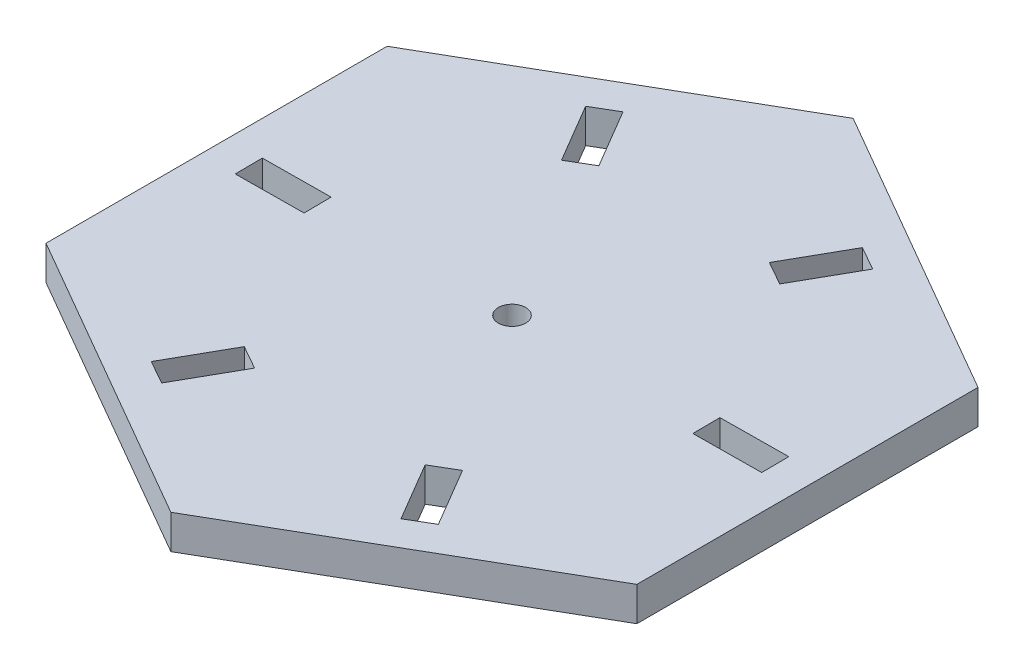
ISO-10303-21;
HEADER;
FILE_DESCRIPTION(('STEP AP214'),'2;1');
FILE_NAME('part.step','',(''),(''),'','','');
FILE_SCHEMA(('AUTOMOTIVE_DESIGN { 1 0 10303 214 1 1 1 1 }'));
ENDSEC;
DATA;
#1=APPLICATION_CONTEXT('core data for automotive mechanical design processes');
#2=APPLICATION_PROTOCOL_DEFINITION('international standard','automotive_design',2000,#1);
#3=PRODUCT_CONTEXT('',#1,'mechanical');
#4=PRODUCT('Part','Part','',(#3));
#5=PRODUCT_RELATED_PRODUCT_CATEGORY('part','',(#4));
#6=PRODUCT_DEFINITION_FORMATION('','',#4);
#7=PRODUCT_DEFINITION_CONTEXT('part definition',#1,'design');
#8=PRODUCT_DEFINITION('design','',#6,#7);
#9=PRODUCT_DEFINITION_SHAPE('','',#8);
#10=(LENGTH_UNIT() NAMED_UNIT(*) SI_UNIT(.MILLI.,.METRE.));
#11=(NAMED_UNIT(*) PLANE_ANGLE_UNIT() SI_UNIT($,.RADIAN.));
#12=(NAMED_UNIT(*) SI_UNIT($,.STERADIAN.) SOLID_ANGLE_UNIT());
#13=UNCERTAINTY_MEASURE_WITH_UNIT(LENGTH_MEASURE(1.E-05),#10,'distance_accuracy_value','');
#14=(GEOMETRIC_REPRESENTATION_CONTEXT(3) GLOBAL_UNCERTAINTY_ASSIGNED_CONTEXT((#13)) GLOBAL_UNIT_ASSIGNED_CONTEXT((#10,
#11,#12)) REPRESENTATION_CONTEXT('',''));
#15=CARTESIAN_POINT('',(0.,0.,0.));
#16=DIRECTION('',(0.,0.,1.));
#17=DIRECTION('',(1.,0.,0.));
#18=AXIS2_PLACEMENT_3D('',#15,#16,#17);
#19=CARTESIAN_POINT('',(13.7481532850787,-3.175,23.8124999999996));
#20=DIRECTION('',(0.500000000000026,0.,0.866025403784424));
#21=DIRECTION('',(0.866025403784424,0.,-0.500000000000026));
#22=AXIS2_PLACEMENT_3D('',#19,#20,#21);
#23=PLANE('',#22);
#24=DIRECTION('',(0.866025403784424,0.,-0.500000000000026));
#25=VECTOR('',#24,1.);
#26=CARTESIAN_POINT('',(13.7481532850787,0.,23.8124999999996));
#27=LINE('',#26,#25);
#28=CARTESIAN_POINT('',(9.57567358739198E-13,0.,31.75));
#29=VERTEX_POINT('',#28);
#30=CARTESIAN_POINT('',(27.4963065701564,0.,15.8749999999992));
#31=VERTEX_POINT('',#30);
#32=EDGE_CURVE('E346',#29,#31,#27,.T.);
#33=ORIENTED_EDGE('',*,*,#32,.F.);
#34=DIRECTION('',(0.,1.,0.));
#35=VECTOR('',#34,1.);
#36=CARTESIAN_POINT('',(9.57567358739198E-13,-3.175,31.75));
#37=LINE('',#36,#35);
#38=CARTESIAN_POINT('',(9.57567358739198E-13,-3.175,31.75));
#39=VERTEX_POINT('',#38);
#40=EDGE_CURVE('E11',#39,#29,#37,.T.);
#41=ORIENTED_EDGE('',*,*,#40,.F.);
#42=DIRECTION('',(0.866025403784424,0.,-0.500000000000026));
#43=VECTOR('',#42,1.);
#44=CARTESIAN_POINT('',(13.7481532850787,-3.175,23.8124999999996));
#45=LINE('',#44,#43);
#46=CARTESIAN_POINT('',(27.4963065701564,-3.175,15.8749999999992));
#47=VERTEX_POINT('',#46);
#48=EDGE_CURVE('E501',#39,#47,#45,.T.);
#49=ORIENTED_EDGE('',*,*,#48,.T.);
#50=DIRECTION('',(0.,1.,0.));
#51=VECTOR('',#50,1.);
#52=CARTESIAN_POINT('',(27.4963065701564,-3.175,15.8749999999992));
#53=LINE('',#52,#51);
#54=EDGE_CURVE('E366',#47,#31,#53,.T.);
#55=ORIENTED_EDGE('',*,*,#54,.T.);
#56=EDGE_LOOP('',(#33,#41,#49,#55));
#57=FACE_BOUND('',#56,.T.);
#58=ADVANCED_FACE('F41',(#57),#23,.T.);
#59=CARTESIAN_POINT('',(-13.7481532850773,-3.175,23.8125000000004));
#60=DIRECTION('',(-0.499999999999974,0.,0.866025403784453));
#61=DIRECTION('',(0.866025403784453,0.,0.499999999999974));
#62=AXIS2_PLACEMENT_3D('',#59,#60,#61);
#63=PLANE('',#62);
#64=DIRECTION('',(0.866025403784453,0.,0.499999999999974));
#65=VECTOR('',#64,1.);
#66=CARTESIAN_POINT('',(-13.7481532850773,0.,23.8125000000004));
#67=LINE('',#66,#65);
#68=CARTESIAN_POINT('',(-27.4963065701554,0.,15.8750000000008));
#69=VERTEX_POINT('',#68);
#70=EDGE_CURVE('E358',#69,#29,#67,.T.);
#71=ORIENTED_EDGE('',*,*,#70,.F.);
#72=DIRECTION('',(0.,1.,0.));
#73=VECTOR('',#72,1.);
#74=CARTESIAN_POINT('',(-27.4963065701554,-3.175,15.8750000000008));
#75=LINE('',#74,#73);
#76=CARTESIAN_POINT('',(-27.4963065701554,-3.175,15.8750000000008));
#77=VERTEX_POINT('',#76);
#78=EDGE_CURVE('E51',#77,#69,#75,.T.);
#79=ORIENTED_EDGE('',*,*,#78,.F.);
#80=DIRECTION('',(0.866025403784453,0.,0.499999999999974));
#81=VECTOR('',#80,1.);
#82=CARTESIAN_POINT('',(-13.7481532850773,-3.175,23.8125000000004));
#83=LINE('',#82,#81);
#84=EDGE_CURVE('E261',#77,#39,#83,.T.);
#85=ORIENTED_EDGE('',*,*,#84,.T.);
#86=ORIENTED_EDGE('',*,*,#40,.T.);
#87=EDGE_LOOP('',(#71,#79,#85,#86));
#88=FACE_BOUND('',#87,.T.);
#89=ADVANCED_FACE('F509',(#88),#63,.T.);
#90=CARTESIAN_POINT('',(-27.4963065701559,-3.175,8.26273029305438E-13));
#91=DIRECTION('',(-1.,0.,0.));
#92=DIRECTION('',(0.,0.,1.));
#93=AXIS2_PLACEMENT_3D('',#90,#91,#92);
#94=PLANE('',#93);
#95=DIRECTION('',(0.,0.,1.));
#96=VECTOR('',#95,1.);
#97=CARTESIAN_POINT('',(-27.4963065701559,0.,8.26273029305438E-13));
#98=LINE('',#97,#96);
#99=CARTESIAN_POINT('',(-27.4963065701564,0.,-15.8749999999992));
#100=VERTEX_POINT('',#99);
#101=EDGE_CURVE('E248',#100,#69,#98,.T.);
#102=ORIENTED_EDGE('',*,*,#101,.F.);
#103=DIRECTION('',(0.,1.,0.));
#104=VECTOR('',#103,1.);
#105=CARTESIAN_POINT('',(-27.4963065701564,-3.175,-15.8749999999992));
#106=LINE('',#105,#104);
#107=CARTESIAN_POINT('',(-27.4963065701564,-3.175,-15.8749999999992));
#108=VERTEX_POINT('',#107);
#109=EDGE_CURVE('E243',#108,#100,#106,.T.);
#110=ORIENTED_EDGE('',*,*,#109,.F.);
#111=DIRECTION('',(0.,0.,1.));
#112=VECTOR('',#111,1.);
#113=CARTESIAN_POINT('',(-27.4963065701559,-3.175,8.26273029305438E-13));
#114=LINE('',#113,#112);
#115=EDGE_CURVE('E246',#108,#77,#114,.T.);
#116=ORIENTED_EDGE('',*,*,#115,.T.);
#117=ORIENTED_EDGE('',*,*,#78,.T.);
#118=EDGE_LOOP('',(#102,#110,#116,#117));
#119=FACE_BOUND('',#118,.T.);
#120=ADVANCED_FACE('F245',(#119),#94,.T.);
#121=CARTESIAN_POINT('',(-13.7481532850787,-3.175,-23.8124999999996));
#122=DIRECTION('',(-0.500000000000025,0.,-0.866025403784424));
#123=DIRECTION('',(-0.866025403784424,0.,0.500000000000025));
#124=AXIS2_PLACEMENT_3D('',#121,#122,#123);
#125=PLANE('',#124);
#126=DIRECTION('',(-0.866025403784424,0.,0.500000000000025));
#127=VECTOR('',#126,1.);
#128=CARTESIAN_POINT('',(-13.7481532850787,0.,-23.8124999999996));
#129=LINE('',#128,#127);
#130=CARTESIAN_POINT('',(-9.40220123979429E-13,0.,-31.75));
#131=VERTEX_POINT('',#130);
#132=EDGE_CURVE('E355',#131,#100,#129,.T.);
#133=ORIENTED_EDGE('',*,*,#132,.F.);
#134=DIRECTION('',(0.,1.,0.));
#135=VECTOR('',#134,1.);
#136=CARTESIAN_POINT('',(-9.40220123979429E-13,-3.175,-31.75));
#137=LINE('',#136,#135);
#138=CARTESIAN_POINT('',(-9.40220123979429E-13,-3.175,-31.75));
#139=VERTEX_POINT('',#138);
#140=EDGE_CURVE('E253',#139,#131,#137,.T.);
#141=ORIENTED_EDGE('',*,*,#140,.F.);
#142=DIRECTION('',(-0.866025403784424,0.,0.500000000000025));
#143=VECTOR('',#142,1.);
#144=CARTESIAN_POINT('',(-13.7481532850787,-3.175,-23.8124999999996));
#145=LINE('',#144,#143);
#146=EDGE_CURVE('E259',#139,#108,#145,.T.);
#147=ORIENTED_EDGE('',*,*,#146,.T.);
#148=ORIENTED_EDGE('',*,*,#109,.T.);
#149=EDGE_LOOP('',(#133,#141,#147,#148));
#150=FACE_BOUND('',#149,.T.);
#151=ADVANCED_FACE('F263',(#150),#125,.T.);
#152=CARTESIAN_POINT('',(13.7481532850772,-3.175,-23.8125000000004));
#153=DIRECTION('',(0.499999999999974,0.,-0.866025403784454));
#154=DIRECTION('',(-0.866025403784454,0.,-0.499999999999974));
#155=AXIS2_PLACEMENT_3D('',#152,#153,#154);
#156=PLANE('',#155);
#157=DIRECTION('',(-0.866025403784454,0.,-0.499999999999974));
#158=VECTOR('',#157,1.);
#159=CARTESIAN_POINT('',(13.7481532850772,0.,-23.8125000000004));
#160=LINE('',#159,#158);
#161=CARTESIAN_POINT('',(27.4963065701555,0.,-15.8750000000008));
#162=VERTEX_POINT('',#161);
#163=EDGE_CURVE('E352',#162,#131,#160,.T.);
#164=ORIENTED_EDGE('',*,*,#163,.F.);
#165=DIRECTION('',(0.,1.,0.));
#166=VECTOR('',#165,1.);
#167=CARTESIAN_POINT('',(27.4963065701555,-3.175,-15.8750000000008));
#168=LINE('',#167,#166);
#169=CARTESIAN_POINT('',(27.4963065701555,-3.175,-15.8750000000008));
#170=VERTEX_POINT('',#169);
#171=EDGE_CURVE('E364',#170,#162,#168,.T.);
#172=ORIENTED_EDGE('',*,*,#171,.F.);
#173=DIRECTION('',(-0.866025403784454,0.,-0.499999999999974));
#174=VECTOR('',#173,1.);
#175=CARTESIAN_POINT('',(13.7481532850772,-3.175,-23.8125000000004));
#176=LINE('',#175,#174);
#177=EDGE_CURVE('E264',#170,#139,#176,.T.);
#178=ORIENTED_EDGE('',*,*,#177,.T.);
#179=ORIENTED_EDGE('',*,*,#140,.T.);
#180=EDGE_LOOP('',(#164,#172,#178,#179));
#181=FACE_BOUND('',#180,.T.);
#182=ADVANCED_FACE('F523',(#181),#156,.T.);
#183=CARTESIAN_POINT('',(-0.0113080051619207,-3.175,-1.26994965609656));
#184=DIRECTION('',(0.0089039410723771,0.,0.999960359130991));
#185=DIRECTION('',(0.999960359130991,0.,-0.0089039410723771));
#186=AXIS2_PLACEMENT_3D('',#183,#184,#185);
#187=PLANE('',#186);
#188=DIRECTION('',(0.999960359130991,0.,-0.0089039410723771));
#189=VECTOR('',#188,1.);
#190=CARTESIAN_POINT('',(-0.0113080051619207,0.,-1.26994965609656));
#191=LINE('',#190,#189);
#192=CARTESIAN_POINT('',(-24.2933906602706,0.,-1.05373485207816));
#193=VERTEX_POINT('',#192);
#194=CARTESIAN_POINT('',(-17.9436423797888,0.,-1.11027487788775));
#195=VERTEX_POINT('',#194);
#196=EDGE_CURVE('E334',#193,#195,#191,.T.);
#197=ORIENTED_EDGE('',*,*,#196,.F.);
#198=DIRECTION('',(0.,1.,0.));
#199=VECTOR('',#198,1.);
#200=CARTESIAN_POINT('',(-24.2933906602706,-3.175,-1.05373485207816));
#201=LINE('',#200,#199);
#202=CARTESIAN_POINT('',(-24.2933906602706,-3.175,-1.05373485207816));
#203=VERTEX_POINT('',#202);
#204=EDGE_CURVE('E368',#203,#193,#201,.T.);
#205=ORIENTED_EDGE('',*,*,#204,.F.);
#206=DIRECTION('',(0.999960359130991,0.,-0.0089039410723771));
#207=VECTOR('',#206,1.);
#208=CARTESIAN_POINT('',(-0.0113080051619207,-3.175,-1.26994965609656));
#209=LINE('',#208,#207);
#210=CARTESIAN_POINT('',(-17.9436423797888,-3.175,-1.11027487788775));
#211=VERTEX_POINT('',#210);
#212=EDGE_CURVE('E489',#203,#211,#209,.T.);
#213=ORIENTED_EDGE('',*,*,#212,.T.);
#214=DIRECTION('',(0.,1.,0.));
#215=VECTOR('',#214,1.);
#216=CARTESIAN_POINT('',(-17.9436423797888,-3.175,-1.11027487788775));
#217=LINE('',#216,#215);
#218=EDGE_CURVE('E374',#211,#195,#217,.T.);
#219=ORIENTED_EDGE('',*,*,#218,.T.);
#220=EDGE_LOOP('',(#197,#205,#213,#219));
#221=FACE_BOUND('',#220,.T.);
#222=ADVANCED_FACE('F526',(#221),#187,.T.);
#223=CARTESIAN_POINT('',(-24.2820826551087,-3.175,0.216214804018442));
#224=DIRECTION('',(0.99996035913099,0.,-0.00890394107237876));
#225=DIRECTION('',(-0.00890394107237877,0.,-0.999960359130991));
#226=AXIS2_PLACEMENT_3D('',#223,#224,#225);
#227=PLANE('',#226);
#228=DIRECTION('',(-0.00890394107237877,0.,-0.999960359130991));
#229=VECTOR('',#228,1.);
#230=CARTESIAN_POINT('',(-24.2820826551087,0.,0.216214804018442));
#231=LINE('',#230,#229);
#232=CARTESIAN_POINT('',(-24.2707746499467,0.,1.48616446011456));
#233=VERTEX_POINT('',#232);
#234=EDGE_CURVE('E343',#233,#193,#231,.T.);
#235=ORIENTED_EDGE('',*,*,#234,.F.);
#236=DIRECTION('',(0.,1.,0.));
#237=VECTOR('',#236,1.);
#238=CARTESIAN_POINT('',(-24.2707746499467,-3.175,1.48616446011456));
#239=LINE('',#238,#237);
#240=CARTESIAN_POINT('',(-24.2707746499467,-3.175,1.48616446011456));
#241=VERTEX_POINT('',#240);
#242=EDGE_CURVE('E370',#241,#233,#239,.T.);
#243=ORIENTED_EDGE('',*,*,#242,.F.);
#244=DIRECTION('',(-0.00890394107237877,0.,-0.999960359130991));
#245=VECTOR('',#244,1.);
#246=CARTESIAN_POINT('',(-24.2820826551087,-3.175,0.216214804018442));
#247=LINE('',#246,#245);
#248=EDGE_CURVE('E498',#241,#203,#247,.T.);
#249=ORIENTED_EDGE('',*,*,#248,.T.);
#250=ORIENTED_EDGE('',*,*,#204,.T.);
#251=EDGE_LOOP('',(#235,#243,#249,#250));
#252=FACE_BOUND('',#251,.T.);
#253=ADVANCED_FACE('F530',(#252),#227,.T.);
#254=CARTESIAN_POINT('',(0.0113080051619173,-3.175,1.26994965609615));
#255=DIRECTION('',(-0.0089039410723773,0.,-0.999960359130991));
#256=DIRECTION('',(-0.999960359130991,0.,0.0089039410723773));
#257=AXIS2_PLACEMENT_3D('',#254,#255,#256);
#258=PLANE('',#257);
#259=DIRECTION('',(-0.999960359130991,0.,0.0089039410723773));
#260=VECTOR('',#259,1.);
#261=CARTESIAN_POINT('',(0.0113080051619173,0.,1.26994965609615));
#262=LINE('',#261,#260);
#263=CARTESIAN_POINT('',(-17.9210263694649,0.,1.42962443430496));
#264=VERTEX_POINT('',#263);
#265=EDGE_CURVE('E340',#264,#233,#262,.T.);
#266=ORIENTED_EDGE('',*,*,#265,.F.);
#267=DIRECTION('',(0.,1.,0.));
#268=VECTOR('',#267,1.);
#269=CARTESIAN_POINT('',(-17.9210263694649,-3.175,1.42962443430496));
#270=LINE('',#269,#268);
#271=CARTESIAN_POINT('',(-17.9210263694649,-3.175,1.42962443430496));
#272=VERTEX_POINT('',#271);
#273=EDGE_CURVE('E372',#272,#264,#270,.T.);
#274=ORIENTED_EDGE('',*,*,#273,.F.);
#275=DIRECTION('',(-0.999960359130991,0.,0.0089039410723773));
#276=VECTOR('',#275,1.);
#277=CARTESIAN_POINT('',(0.0113080051619173,-3.175,1.26994965609615));
#278=LINE('',#277,#276);
#279=EDGE_CURVE('E495',#272,#241,#278,.T.);
#280=ORIENTED_EDGE('',*,*,#279,.T.);
#281=ORIENTED_EDGE('',*,*,#242,.T.);
#282=EDGE_LOOP('',(#266,#274,#280,#281));
#283=FACE_BOUND('',#282,.T.);
#284=ADVANCED_FACE('F533',(#283),#258,.T.);
#285=CARTESIAN_POINT('',(-12.3282888405086,-3.175,-20.9207930341084));
#286=DIRECTION('',(0.507691218727973,0.,0.86153910324866));
#287=DIRECTION('',(0.86153910324866,0.,-0.507691218727973));
#288=AXIS2_PLACEMENT_3D('',#285,#286,#287);
#289=PLANE('',#288);
#290=DIRECTION('',(0.86153910324866,0.,-0.507691218727973));
#291=VECTOR('',#290,1.);
#292=CARTESIAN_POINT('',(-12.3282888405086,0.,-20.9207930341084));
#293=LINE('',#292,#291);
#294=CARTESIAN_POINT('',(-13.4224435016344,0.,-20.2760251863239));
#295=VERTEX_POINT('',#294);
#296=CARTESIAN_POINT('',(-11.2341341793828,0.,-21.565560881893));
#297=VERTEX_POINT('',#296);
#298=EDGE_CURVE('E319',#295,#297,#293,.T.);
#299=ORIENTED_EDGE('',*,*,#298,.F.);
#300=DIRECTION('',(0.,1.,0.));
#301=VECTOR('',#300,1.);
#302=CARTESIAN_POINT('',(-13.4224435016344,-3.175,-20.2760251863239));
#303=LINE('',#302,#301);
#304=CARTESIAN_POINT('',(-13.4224435016344,-3.175,-20.2760251863239));
#305=VERTEX_POINT('',#304);
#306=EDGE_CURVE('E376',#305,#295,#303,.T.);
#307=ORIENTED_EDGE('',*,*,#306,.F.);
#308=DIRECTION('',(0.86153910324866,0.,-0.507691218727973));
#309=VECTOR('',#308,1.);
#310=CARTESIAN_POINT('',(-12.3282888405086,-3.175,-20.9207930341084));
#311=LINE('',#310,#309);
#312=CARTESIAN_POINT('',(-11.2341341793828,-3.175,-21.565560881893));
#313=VERTEX_POINT('',#312);
#314=EDGE_CURVE('E474',#305,#313,#311,.T.);
#315=ORIENTED_EDGE('',*,*,#314,.T.);
#316=DIRECTION('',(0.,1.,0.));
#317=VECTOR('',#316,1.);
#318=CARTESIAN_POINT('',(-11.2341341793828,-3.175,-21.565560881893));
#319=LINE('',#318,#317);
#320=EDGE_CURVE('E382',#313,#297,#319,.T.);
#321=ORIENTED_EDGE('',*,*,#320,.T.);
#322=EDGE_LOOP('',(#299,#307,#315,#321));
#323=FACE_BOUND('',#322,.T.);
#324=ADVANCED_FACE('F537',(#323),#289,.T.);
#325=CARTESIAN_POINT('',(-1.0941546611258,-3.175,0.644767847784525));
#326=DIRECTION('',(0.86153910324866,0.,-0.507691218727973));
#327=DIRECTION('',(-0.507691218727973,0.,-0.86153910324866));
#328=AXIS2_PLACEMENT_3D('',#325,#326,#327);
#329=PLANE('',#328);
#330=DIRECTION('',(-0.507691218727973,0.,-0.86153910324866));
#331=VECTOR('',#330,1.);
#332=CARTESIAN_POINT('',(-1.0941546611258,0.,0.644767847784525));
#333=LINE('',#332,#331);
#334=CARTESIAN_POINT('',(-10.1986042627117,0.,-14.8052518806949));
#335=VERTEX_POINT('',#334);
#336=EDGE_CURVE('E328',#335,#295,#333,.T.);
#337=ORIENTED_EDGE('',*,*,#336,.F.);
#338=DIRECTION('',(0.,1.,0.));
#339=VECTOR('',#338,1.);
#340=CARTESIAN_POINT('',(-10.1986042627117,-3.175,-14.8052518806949));
#341=LINE('',#340,#339);
#342=CARTESIAN_POINT('',(-10.1986042627117,-3.175,-14.8052518806949));
#343=VERTEX_POINT('',#342);
#344=EDGE_CURVE('E378',#343,#335,#341,.T.);
#345=ORIENTED_EDGE('',*,*,#344,.F.);
#346=DIRECTION('',(-0.507691218727973,0.,-0.86153910324866));
#347=VECTOR('',#346,1.);
#348=CARTESIAN_POINT('',(-1.0941546611258,-3.175,0.644767847784525));
#349=LINE('',#348,#347);
#350=EDGE_CURVE('E483',#343,#305,#349,.T.);
#351=ORIENTED_EDGE('',*,*,#350,.T.);
#352=ORIENTED_EDGE('',*,*,#306,.T.);
#353=EDGE_LOOP('',(#337,#345,#351,#352));
#354=FACE_BOUND('',#353,.T.);
#355=ADVANCED_FACE('F552',(#354),#329,.T.);
#356=CARTESIAN_POINT('',(-9.10444960158593,-3.175,-15.4500197284795));
#357=DIRECTION('',(-0.507691218727973,0.,-0.86153910324866));
#358=DIRECTION('',(-0.86153910324866,0.,0.507691218727973));
#359=AXIS2_PLACEMENT_3D('',#356,#357,#358);
#360=PLANE('',#359);
#361=DIRECTION('',(-0.86153910324866,0.,0.507691218727973));
#362=VECTOR('',#361,1.);
#363=CARTESIAN_POINT('',(-9.10444960158593,0.,-15.4500197284795));
#364=LINE('',#363,#362);
#365=CARTESIAN_POINT('',(-8.01029494046014,0.,-16.094787576264));
#366=VERTEX_POINT('',#365);
#367=EDGE_CURVE('E325',#366,#335,#364,.T.);
#368=ORIENTED_EDGE('',*,*,#367,.F.);
#369=DIRECTION('',(0.,1.,0.));
#370=VECTOR('',#369,1.);
#371=CARTESIAN_POINT('',(-8.01029494046014,-3.175,-16.094787576264));
#372=LINE('',#371,#370);
#373=CARTESIAN_POINT('',(-8.01029494046014,-3.175,-16.094787576264));
#374=VERTEX_POINT('',#373);
#375=EDGE_CURVE('E380',#374,#366,#372,.T.);
#376=ORIENTED_EDGE('',*,*,#375,.F.);
#377=DIRECTION('',(-0.86153910324866,0.,0.507691218727973));
#378=VECTOR('',#377,1.);
#379=CARTESIAN_POINT('',(-9.10444960158593,-3.175,-15.4500197284795));
#380=LINE('',#379,#378);
#381=EDGE_CURVE('E480',#374,#343,#380,.T.);
#382=ORIENTED_EDGE('',*,*,#381,.T.);
#383=ORIENTED_EDGE('',*,*,#344,.T.);
#384=EDGE_LOOP('',(#368,#376,#382,#383));
#385=FACE_BOUND('',#384,.T.);
#386=ADVANCED_FACE('F555',(#385),#360,.T.);
#387=CARTESIAN_POINT('',(11.9537938146001,-3.175,-21.1370078381267));
#388=DIRECTION('',(-0.492269140403017,0.,0.870443044321037));
#389=DIRECTION('',(0.870443044321037,0.,0.492269140403017));
#390=AXIS2_PLACEMENT_3D('',#387,#388,#389);
#391=PLANE('',#390);
#392=DIRECTION('',(0.870443044321037,0.,0.492269140403017));
#393=VECTOR('',#392,1.);
#394=CARTESIAN_POINT('',(11.9537938146001,0.,-21.1370078381267));
#395=LINE('',#394,#393);
#396=CARTESIAN_POINT('',(10.8483311483122,0.,-21.7621896464386));
#397=VERTEX_POINT('',#396);
#398=CARTESIAN_POINT('',(13.0592564808877,0.,-20.511826029815));
#399=VERTEX_POINT('',#398);
#400=EDGE_CURVE('E307',#397,#399,#395,.T.);
#401=ORIENTED_EDGE('',*,*,#400,.F.);
#402=DIRECTION('',(0.,1.,0.));
#403=VECTOR('',#402,1.);
#404=CARTESIAN_POINT('',(10.8483311483122,-3.175,-21.7621896464386));
#405=LINE('',#404,#403);
#406=CARTESIAN_POINT('',(10.8483311483122,-3.175,-21.7621896464386));
#407=VERTEX_POINT('',#406);
#408=EDGE_CURVE('E384',#407,#397,#405,.T.);
#409=ORIENTED_EDGE('',*,*,#408,.F.);
#410=DIRECTION('',(0.870443044321037,0.,0.492269140403017));
#411=VECTOR('',#410,1.);
#412=CARTESIAN_POINT('',(11.9537938146001,-3.175,-21.1370078381267));
#413=LINE('',#412,#411);
#414=CARTESIAN_POINT('',(13.0592564808877,-3.175,-20.511826029815));
#415=VERTEX_POINT('',#414);
#416=EDGE_CURVE('E462',#407,#415,#413,.T.);
#417=ORIENTED_EDGE('',*,*,#416,.T.);
#418=DIRECTION('',(0.,1.,0.));
#419=VECTOR('',#418,1.);
#420=CARTESIAN_POINT('',(13.0592564808877,-3.175,-20.511826029815));
#421=LINE('',#420,#419);
#422=EDGE_CURVE('E390',#415,#399,#421,.T.);
#423=ORIENTED_EDGE('',*,*,#422,.T.);
#424=EDGE_LOOP('',(#401,#409,#417,#423));
#425=FACE_BOUND('',#424,.T.);
#426=ADVANCED_FACE('F559',(#425),#391,.T.);
#427=CARTESIAN_POINT('',(-1.10546266628786,-3.175,-0.62518180831191));
#428=DIRECTION('',(0.870443044321037,0.,0.492269140403017));
#429=DIRECTION('',(0.492269140403017,0.,-0.870443044321037));
#430=AXIS2_PLACEMENT_3D('',#427,#428,#429);
#431=PLANE('',#430);
#432=DIRECTION('',(0.492269140403017,0.,-0.870443044321037));
#433=VECTOR('',#432,1.);
#434=CARTESIAN_POINT('',(-1.10546266628786,0.,-0.62518180831191));
#435=LINE('',#434,#433);
#436=CARTESIAN_POINT('',(7.72242210675306,0.,-16.234876315));
#437=VERTEX_POINT('',#436);
#438=EDGE_CURVE('E316',#437,#397,#435,.T.);
#439=ORIENTED_EDGE('',*,*,#438,.F.);
#440=DIRECTION('',(0.,1.,0.));
#441=VECTOR('',#440,1.);
#442=CARTESIAN_POINT('',(7.72242210675306,-3.175,-16.234876315));
#443=LINE('',#442,#441);
#444=CARTESIAN_POINT('',(7.72242210675306,-3.175,-16.234876315));
#445=VERTEX_POINT('',#444);
#446=EDGE_CURVE('E386',#445,#437,#443,.T.);
#447=ORIENTED_EDGE('',*,*,#446,.F.);
#448=DIRECTION('',(0.492269140403017,0.,-0.870443044321037));
#449=VECTOR('',#448,1.);
#450=CARTESIAN_POINT('',(-1.10546266628786,-3.175,-0.62518180831191));
#451=LINE('',#450,#449);
#452=EDGE_CURVE('E471',#445,#407,#451,.T.);
#453=ORIENTED_EDGE('',*,*,#452,.T.);
#454=ORIENTED_EDGE('',*,*,#408,.T.);
#455=EDGE_LOOP('',(#439,#447,#453,#454));
#456=FACE_BOUND('',#455,.T.);
#457=ADVANCED_FACE('F568',(#456),#431,.T.);
#458=CARTESIAN_POINT('',(8.82788477304093,-3.175,-15.6096945066881));
#459=DIRECTION('',(0.492269140403018,0.,-0.870443044321037));
#460=DIRECTION('',(-0.870443044321037,0.,-0.492269140403018));
#461=AXIS2_PLACEMENT_3D('',#458,#459,#460);
#462=PLANE('',#461);
#463=DIRECTION('',(-0.870443044321037,0.,-0.492269140403018));
#464=VECTOR('',#463,1.);
#465=CARTESIAN_POINT('',(8.82788477304093,0.,-15.6096945066881));
#466=LINE('',#465,#464);
#467=CARTESIAN_POINT('',(9.93334743932849,0.,-14.9845126983764));
#468=VERTEX_POINT('',#467);
#469=EDGE_CURVE('E313',#468,#437,#466,.T.);
#470=ORIENTED_EDGE('',*,*,#469,.F.);
#471=DIRECTION('',(0.,1.,0.));
#472=VECTOR('',#471,1.);
#473=CARTESIAN_POINT('',(9.93334743932849,-3.175,-14.9845126983764));
#474=LINE('',#473,#472);
#475=CARTESIAN_POINT('',(9.93334743932849,-3.175,-14.9845126983764));
#476=VERTEX_POINT('',#475);
#477=EDGE_CURVE('E388',#476,#468,#474,.T.);
#478=ORIENTED_EDGE('',*,*,#477,.F.);
#479=DIRECTION('',(-0.870443044321037,0.,-0.492269140403018));
#480=VECTOR('',#479,1.);
#481=CARTESIAN_POINT('',(8.82788477304093,-3.175,-15.6096945066881));
#482=LINE('',#481,#480);
#483=EDGE_CURVE('E468',#476,#445,#482,.T.);
#484=ORIENTED_EDGE('',*,*,#483,.T.);
#485=ORIENTED_EDGE('',*,*,#446,.T.);
#486=EDGE_LOOP('',(#470,#478,#484,#485));
#487=FACE_BOUND('',#486,.T.);
#488=ADVANCED_FACE('F571',(#487),#462,.T.);
#489=CARTESIAN_POINT('',(24.2820826551084,-3.175,-0.216214804018439));
#490=DIRECTION('',(-0.99996035913099,0.,0.00890394107237877));
#491=DIRECTION('',(0.00890394107237877,0.,0.999960359130991));
#492=AXIS2_PLACEMENT_3D('',#489,#490,#491);
#493=PLANE('',#492);
#494=DIRECTION('',(0.00890394107237877,0.,0.999960359130991));
#495=VECTOR('',#494,1.);
#496=CARTESIAN_POINT('',(24.2820826551084,0.,-0.216214804018439));
#497=LINE('',#496,#495);
#498=CARTESIAN_POINT('',(24.2707746499464,0.,-1.48616446011487));
#499=VERTEX_POINT('',#498);
#500=CARTESIAN_POINT('',(24.2933906602703,0.,1.05373485207785));
#501=VERTEX_POINT('',#500);
#502=EDGE_CURVE('E295',#499,#501,#497,.T.);
#503=ORIENTED_EDGE('',*,*,#502,.F.);
#504=DIRECTION('',(0.,1.,0.));
#505=VECTOR('',#504,1.);
#506=CARTESIAN_POINT('',(24.2707746499464,-3.175,-1.48616446011487));
#507=LINE('',#506,#505);
#508=CARTESIAN_POINT('',(24.2707746499464,-3.175,-1.48616446011487));
#509=VERTEX_POINT('',#508);
#510=EDGE_CURVE('E392',#509,#499,#507,.T.);
#511=ORIENTED_EDGE('',*,*,#510,.F.);
#512=DIRECTION('',(0.00890394107237877,0.,0.999960359130991));
#513=VECTOR('',#512,1.);
#514=CARTESIAN_POINT('',(24.2820826551084,-3.175,-0.216214804018439));
#515=LINE('',#514,#513);
#516=CARTESIAN_POINT('',(24.2933906602703,-3.175,1.05373485207785));
#517=VERTEX_POINT('',#516);
#518=EDGE_CURVE('E450',#509,#517,#515,.T.);
#519=ORIENTED_EDGE('',*,*,#518,.T.);
#520=DIRECTION('',(0.,1.,0.));
#521=VECTOR('',#520,1.);
#522=CARTESIAN_POINT('',(24.2933906602703,-3.175,1.05373485207785));
#523=LINE('',#522,#521);
#524=EDGE_CURVE('E398',#517,#501,#523,.T.);
#525=ORIENTED_EDGE('',*,*,#524,.T.);
#526=EDGE_LOOP('',(#503,#511,#519,#525));
#527=FACE_BOUND('',#526,.T.);
#528=ADVANCED_FACE('F575',(#527),#493,.T.);
#529=CARTESIAN_POINT('',(-0.0113080051619198,-3.175,-1.26994965609647));
#530=DIRECTION('',(0.00890394107237704,0.,0.999960359130991));
#531=DIRECTION('',(0.999960359130991,0.,-0.00890394107237704));
#532=AXIS2_PLACEMENT_3D('',#529,#530,#531);
#533=PLANE('',#532);
#534=DIRECTION('',(0.999960359130991,0.,-0.00890394107237704));
#535=VECTOR('',#534,1.);
#536=CARTESIAN_POINT('',(-0.0113080051619198,0.,-1.26994965609647));
#537=LINE('',#536,#535);
#538=CARTESIAN_POINT('',(17.9210263694646,0.,-1.42962443430527));
#539=VERTEX_POINT('',#538);
#540=EDGE_CURVE('E304',#539,#499,#537,.T.);
#541=ORIENTED_EDGE('',*,*,#540,.F.);
#542=DIRECTION('',(0.,1.,0.));
#543=VECTOR('',#542,1.);
#544=CARTESIAN_POINT('',(17.9210263694646,-3.175,-1.42962443430527));
#545=LINE('',#544,#543);
#546=CARTESIAN_POINT('',(17.9210263694646,-3.175,-1.42962443430527));
#547=VERTEX_POINT('',#546);
#548=EDGE_CURVE('E394',#547,#539,#545,.T.);
#549=ORIENTED_EDGE('',*,*,#548,.F.);
#550=DIRECTION('',(0.999960359130991,0.,-0.00890394107237704));
#551=VECTOR('',#550,1.);
#552=CARTESIAN_POINT('',(-0.0113080051619198,-3.175,-1.26994965609647));
#553=LINE('',#552,#551);
#554=EDGE_CURVE('E459',#547,#509,#553,.T.);
#555=ORIENTED_EDGE('',*,*,#554,.T.);
#556=ORIENTED_EDGE('',*,*,#510,.T.);
#557=EDGE_LOOP('',(#541,#549,#555,#556));
#558=FACE_BOUND('',#557,.T.);
#559=ADVANCED_FACE('F584',(#558),#533,.T.);
#560=CARTESIAN_POINT('',(17.9323343746266,-3.175,-0.159674778208786));
#561=DIRECTION('',(0.999960359130991,0.,-0.00890394107237605));
#562=DIRECTION('',(-0.00890394107237605,0.,-0.999960359130991));
#563=AXIS2_PLACEMENT_3D('',#560,#561,#562);
#564=PLANE('',#563);
#565=DIRECTION('',(-0.00890394107237605,0.,-0.999960359130991));
#566=VECTOR('',#565,1.);
#567=CARTESIAN_POINT('',(17.9323343746266,0.,-0.159674778208786));
#568=LINE('',#567,#566);
#569=CARTESIAN_POINT('',(17.9436423797885,0.,1.11027487788744));
#570=VERTEX_POINT('',#569);
#571=EDGE_CURVE('E301',#570,#539,#568,.T.);
#572=ORIENTED_EDGE('',*,*,#571,.F.);
#573=DIRECTION('',(0.,1.,0.));
#574=VECTOR('',#573,1.);
#575=CARTESIAN_POINT('',(17.9436423797885,-3.175,1.11027487788744));
#576=LINE('',#575,#574);
#577=CARTESIAN_POINT('',(17.9436423797885,-3.175,1.11027487788744));
#578=VERTEX_POINT('',#577);
#579=EDGE_CURVE('E396',#578,#570,#576,.T.);
#580=ORIENTED_EDGE('',*,*,#579,.F.);
#581=DIRECTION('',(-0.00890394107237605,0.,-0.999960359130991));
#582=VECTOR('',#581,1.);
#583=CARTESIAN_POINT('',(17.9323343746266,-3.175,-0.159674778208786));
#584=LINE('',#583,#582);
#585=EDGE_CURVE('E456',#578,#547,#584,.T.);
#586=ORIENTED_EDGE('',*,*,#585,.T.);
#587=ORIENTED_EDGE('',*,*,#548,.T.);
#588=EDGE_LOOP('',(#572,#580,#586,#587));
#589=FACE_BOUND('',#588,.T.);
#590=ADVANCED_FACE('F587',(#589),#564,.T.);
#591=CARTESIAN_POINT('',(12.328288840507,-3.175,20.920793034109));
#592=DIRECTION('',(-0.507691218727915,0.,-0.861539103248695));
#593=DIRECTION('',(-0.861539103248695,0.,0.507691218727915));
#594=AXIS2_PLACEMENT_3D('',#591,#592,#593);
#595=PLANE('',#594);
#596=DIRECTION('',(-0.861539103248695,0.,0.507691218727915));
#597=VECTOR('',#596,1.);
#598=CARTESIAN_POINT('',(12.328288840507,0.,20.920793034109));
#599=LINE('',#598,#597);
#600=CARTESIAN_POINT('',(13.4224435016346,0.,20.2760251863236));
#601=VERTEX_POINT('',#600);
#602=CARTESIAN_POINT('',(11.2341341793829,0.,21.5655608818925));
#603=VERTEX_POINT('',#602);
#604=EDGE_CURVE('E283',#601,#603,#599,.T.);
#605=ORIENTED_EDGE('',*,*,#604,.F.);
#606=DIRECTION('',(0.,1.,0.));
#607=VECTOR('',#606,1.);
#608=CARTESIAN_POINT('',(13.4224435016346,-3.175,20.2760251863236));
#609=LINE('',#608,#607);
#610=CARTESIAN_POINT('',(13.4224435016346,-3.175,20.2760251863236));
#611=VERTEX_POINT('',#610);
#612=EDGE_CURVE('E400',#611,#601,#609,.T.);
#613=ORIENTED_EDGE('',*,*,#612,.F.);
#614=DIRECTION('',(-0.861539103248695,0.,0.507691218727915));
#615=VECTOR('',#614,1.);
#616=CARTESIAN_POINT('',(12.328288840507,-3.175,20.920793034109));
#617=LINE('',#616,#615);
#618=CARTESIAN_POINT('',(11.2341341793829,-3.175,21.5655608818925));
#619=VERTEX_POINT('',#618);
#620=EDGE_CURVE('E438',#611,#619,#617,.T.);
#621=ORIENTED_EDGE('',*,*,#620,.T.);
#622=DIRECTION('',(0.,1.,0.));
#623=VECTOR('',#622,1.);
#624=CARTESIAN_POINT('',(11.2341341793829,-3.175,21.5655608818925));
#625=LINE('',#624,#623);
#626=EDGE_CURVE('E406',#619,#603,#625,.T.);
#627=ORIENTED_EDGE('',*,*,#626,.T.);
#628=EDGE_LOOP('',(#605,#613,#621,#627));
#629=FACE_BOUND('',#628,.T.);
#630=ADVANCED_FACE('F591',(#629),#595,.T.);
#631=CARTESIAN_POINT('',(1.09415466112451,-3.175,-0.644767847783879));
#632=DIRECTION('',(-0.861539103248622,0.,0.507691218728037));
#633=DIRECTION('',(0.507691218728037,0.,0.861539103248622));
#634=AXIS2_PLACEMENT_3D('',#631,#632,#633);
#635=PLANE('',#634);
#636=DIRECTION('',(0.507691218728037,0.,0.861539103248622));
#637=VECTOR('',#636,1.);
#638=CARTESIAN_POINT('',(1.09415466112451,0.,-0.644767847783879));
#639=LINE('',#638,#637);
#640=CARTESIAN_POINT('',(10.1986042627114,0.,14.8052518806946));
#641=VERTEX_POINT('',#640);
#642=EDGE_CURVE('E292',#641,#601,#639,.T.);
#643=ORIENTED_EDGE('',*,*,#642,.F.);
#644=DIRECTION('',(0.,1.,0.));
#645=VECTOR('',#644,1.);
#646=CARTESIAN_POINT('',(10.1986042627114,-3.175,14.8052518806946));
#647=LINE('',#646,#645);
#648=CARTESIAN_POINT('',(10.1986042627114,-3.175,14.8052518806946));
#649=VERTEX_POINT('',#648);
#650=EDGE_CURVE('E402',#649,#641,#647,.T.);
#651=ORIENTED_EDGE('',*,*,#650,.F.);
#652=DIRECTION('',(0.507691218728037,0.,0.861539103248622));
#653=VECTOR('',#652,1.);
#654=CARTESIAN_POINT('',(1.09415466112451,-3.175,-0.644767847783879));
#655=LINE('',#654,#653);
#656=EDGE_CURVE('E447',#649,#611,#655,.T.);
#657=ORIENTED_EDGE('',*,*,#656,.T.);
#658=ORIENTED_EDGE('',*,*,#612,.T.);
#659=EDGE_LOOP('',(#643,#651,#657,#658));
#660=FACE_BOUND('',#659,.T.);
#661=ADVANCED_FACE('F600',(#660),#635,.T.);
#662=CARTESIAN_POINT('',(9.10444960158572,-3.175,15.4500197284791));
#663=DIRECTION('',(0.507691218727974,0.,0.86153910324866));
#664=DIRECTION('',(0.86153910324866,0.,-0.507691218727974));
#665=AXIS2_PLACEMENT_3D('',#662,#663,#664);
#666=PLANE('',#665);
#667=DIRECTION('',(0.86153910324866,0.,-0.507691218727974));
#668=VECTOR('',#667,1.);
#669=CARTESIAN_POINT('',(9.10444960158572,0.,15.4500197284791));
#670=LINE('',#669,#668);
#671=CARTESIAN_POINT('',(8.01029494045983,0.,16.0947875762637));
#672=VERTEX_POINT('',#671);
#673=EDGE_CURVE('E289',#672,#641,#670,.T.);
#674=ORIENTED_EDGE('',*,*,#673,.F.);
#675=DIRECTION('',(0.,1.,0.));
#676=VECTOR('',#675,1.);
#677=CARTESIAN_POINT('',(8.01029494045983,-3.175,16.0947875762637));
#678=LINE('',#677,#676);
#679=CARTESIAN_POINT('',(8.01029494045983,-3.175,16.0947875762637));
#680=VERTEX_POINT('',#679);
#681=EDGE_CURVE('E404',#680,#672,#678,.T.);
#682=ORIENTED_EDGE('',*,*,#681,.F.);
#683=DIRECTION('',(0.86153910324866,0.,-0.507691218727974));
#684=VECTOR('',#683,1.);
#685=CARTESIAN_POINT('',(9.10444960158572,-3.175,15.4500197284791));
#686=LINE('',#685,#684);
#687=EDGE_CURVE('E444',#680,#649,#686,.T.);
#688=ORIENTED_EDGE('',*,*,#687,.T.);
#689=ORIENTED_EDGE('',*,*,#650,.T.);
#690=EDGE_LOOP('',(#674,#682,#688,#689));
#691=FACE_BOUND('',#690,.T.);
#692=ADVANCED_FACE('F603',(#691),#666,.T.);
#693=CARTESIAN_POINT('',(-11.9537938146,-3.175,21.1370078381266));
#694=DIRECTION('',(0.492269140403016,0.,-0.870443044321037));
#695=DIRECTION('',(-0.870443044321037,0.,-0.492269140403016));
#696=AXIS2_PLACEMENT_3D('',#693,#694,#695);
#697=PLANE('',#696);
#698=DIRECTION('',(-0.870443044321037,0.,-0.492269140403016));
#699=VECTOR('',#698,1.);
#700=CARTESIAN_POINT('',(-11.9537938146,0.,21.1370078381266));
#701=LINE('',#700,#699);
#702=CARTESIAN_POINT('',(-10.8483311483125,0.,21.7621896464383));
#703=VERTEX_POINT('',#702);
#704=CARTESIAN_POINT('',(-13.059256480888,0.,20.5118260298146));
#705=VERTEX_POINT('',#704);
#706=EDGE_CURVE('E271',#703,#705,#701,.T.);
#707=ORIENTED_EDGE('',*,*,#706,.F.);
#708=DIRECTION('',(0.,1.,0.));
#709=VECTOR('',#708,1.);
#710=CARTESIAN_POINT('',(-10.8483311483125,-3.175,21.7621896464383));
#711=LINE('',#710,#709);
#712=CARTESIAN_POINT('',(-10.8483311483125,-3.175,21.7621896464383));
#713=VERTEX_POINT('',#712);
#714=EDGE_CURVE('E408',#713,#703,#711,.T.);
#715=ORIENTED_EDGE('',*,*,#714,.F.);
#716=DIRECTION('',(-0.870443044321037,0.,-0.492269140403016));
#717=VECTOR('',#716,1.);
#718=CARTESIAN_POINT('',(-11.9537938146,-3.175,21.1370078381266));
#719=LINE('',#718,#717);
#720=CARTESIAN_POINT('',(-13.059256480888,-3.175,20.5118260298146));
#721=VERTEX_POINT('',#720);
#722=EDGE_CURVE('E360',#713,#721,#719,.T.);
#723=ORIENTED_EDGE('',*,*,#722,.T.);
#724=DIRECTION('',(0.,1.,0.));
#725=VECTOR('',#724,1.);
#726=CARTESIAN_POINT('',(-13.059256480888,-3.175,20.5118260298146));
#727=LINE('',#726,#725);
#728=EDGE_CURVE('E45',#721,#705,#727,.T.);
#729=ORIENTED_EDGE('',*,*,#728,.T.);
#730=EDGE_LOOP('',(#707,#715,#723,#729));
#731=FACE_BOUND('',#730,.T.);
#732=ADVANCED_FACE('F43',(#731),#697,.T.);
#733=CARTESIAN_POINT('',(1.10546266628748,-3.175,0.625181808311697));
#734=DIRECTION('',(-0.870443044321037,0.,-0.492269140403017));
#735=DIRECTION('',(-0.492269140403017,0.,0.870443044321037));
#736=AXIS2_PLACEMENT_3D('',#733,#734,#735);
#737=PLANE('',#736);
#738=DIRECTION('',(-0.492269140403017,0.,0.870443044321037));
#739=VECTOR('',#738,1.);
#740=CARTESIAN_POINT('',(1.10546266628748,0.,0.625181808311697));
#741=LINE('',#740,#739);
#742=CARTESIAN_POINT('',(-7.72242210675337,0.,16.2348763149997));
#743=VERTEX_POINT('',#742);
#744=EDGE_CURVE('E280',#743,#703,#741,.T.);
#745=ORIENTED_EDGE('',*,*,#744,.F.);
#746=DIRECTION('',(0.,1.,0.));
#747=VECTOR('',#746,1.);
#748=CARTESIAN_POINT('',(-7.72242210675337,-3.175,16.2348763149997));
#749=LINE('',#748,#747);
#750=CARTESIAN_POINT('',(-7.72242210675337,-3.175,16.2348763149997));
#751=VERTEX_POINT('',#750);
#752=EDGE_CURVE('E410',#751,#743,#749,.T.);
#753=ORIENTED_EDGE('',*,*,#752,.F.);
#754=DIRECTION('',(-0.492269140403017,0.,0.870443044321037));
#755=VECTOR('',#754,1.);
#756=CARTESIAN_POINT('',(1.10546266628748,-3.175,0.625181808311697));
#757=LINE('',#756,#755);
#758=EDGE_CURVE('E427',#751,#713,#757,.T.);
#759=ORIENTED_EDGE('',*,*,#758,.T.);
#760=ORIENTED_EDGE('',*,*,#714,.T.);
#761=EDGE_LOOP('',(#745,#753,#759,#760));
#762=FACE_BOUND('',#761,.T.);
#763=ADVANCED_FACE('F423',(#762),#737,.T.);
#764=CARTESIAN_POINT('',(-8.82788477304085,-3.175,15.609694506688));
#765=DIRECTION('',(-0.492269140403017,0.,0.870443044321037));
#766=DIRECTION('',(0.870443044321037,0.,0.492269140403017));
#767=AXIS2_PLACEMENT_3D('',#764,#765,#766);
#768=PLANE('',#767);
#769=DIRECTION('',(0.870443044321037,0.,0.492269140403017));
#770=VECTOR('',#769,1.);
#771=CARTESIAN_POINT('',(-8.82788477304085,0.,15.609694506688));
#772=LINE('',#771,#770);
#773=CARTESIAN_POINT('',(-9.9333474393288,0.,14.9845126983761));
#774=VERTEX_POINT('',#773);
#775=EDGE_CURVE('E277',#774,#743,#772,.T.);
#776=ORIENTED_EDGE('',*,*,#775,.F.);
#777=DIRECTION('',(0.,1.,0.));
#778=VECTOR('',#777,1.);
#779=CARTESIAN_POINT('',(-9.9333474393288,-3.175,14.9845126983761));
#780=LINE('',#779,#778);
#781=CARTESIAN_POINT('',(-9.9333474393288,-3.175,14.9845126983761));
#782=VERTEX_POINT('',#781);
#783=EDGE_CURVE('E411',#782,#774,#780,.T.);
#784=ORIENTED_EDGE('',*,*,#783,.F.);
#785=DIRECTION('',(0.870443044321037,0.,0.492269140403017));
#786=VECTOR('',#785,1.);
#787=CARTESIAN_POINT('',(-8.82788477304085,-3.175,15.609694506688));
#788=LINE('',#787,#786);
#789=EDGE_CURVE('E433',#782,#751,#788,.T.);
#790=ORIENTED_EDGE('',*,*,#789,.T.);
#791=ORIENTED_EDGE('',*,*,#752,.T.);
#792=EDGE_LOOP('',(#776,#784,#790,#791));
#793=FACE_BOUND('',#792,.T.);
#794=ADVANCED_FACE('F543',(#793),#768,.T.);
#795=CARTESIAN_POINT('',(-17.9323343746269,-3.175,0.159674778208861));
#796=DIRECTION('',(-0.99996035913099,0.,0.00890394107238013));
#797=DIRECTION('',(0.00890394107238014,0.,0.999960359130991));
#798=AXIS2_PLACEMENT_3D('',#795,#796,#797);
#799=PLANE('',#798);
#800=DIRECTION('',(0.00890394107238014,0.,0.999960359130991));
#801=VECTOR('',#800,1.);
#802=CARTESIAN_POINT('',(-17.9323343746269,0.,0.159674778208861));
#803=LINE('',#802,#801);
#804=EDGE_CURVE('E337',#195,#264,#803,.T.);
#805=ORIENTED_EDGE('',*,*,#804,.F.);
#806=ORIENTED_EDGE('',*,*,#218,.F.);
#807=DIRECTION('',(0.00890394107238014,0.,0.999960359130991));
#808=VECTOR('',#807,1.);
#809=CARTESIAN_POINT('',(-17.9323343746269,-3.175,0.159674778208861));
#810=LINE('',#809,#808);
#811=EDGE_CURVE('E492',#211,#272,#810,.T.);
#812=ORIENTED_EDGE('',*,*,#811,.T.);
#813=ORIENTED_EDGE('',*,*,#273,.T.);
#814=EDGE_LOOP('',(#805,#806,#812,#813));
#815=FACE_BOUND('',#814,.T.);
#816=ADVANCED_FACE('F539',(#815),#799,.T.);
#817=CARTESIAN_POINT('',(0.,-3.175,0.));
#818=DIRECTION('',(0.,1.,0.));
#819=DIRECTION('',(0.,0.,1.));
#820=AXIS2_PLACEMENT_3D('',#817,#818,#819);
#821=CYLINDRICAL_SURFACE('',#820,1.27);
#822=CARTESIAN_POINT('',(0.,-3.175,0.));
#823=DIRECTION('',(0.,1.,0.));
#824=DIRECTION('',(0.,0.,1.));
#825=AXIS2_PLACEMENT_3D('',#822,#823,#824);
#826=CIRCLE('',#825,1.27);
#827=CARTESIAN_POINT('',(0.,-3.175,1.27));
#828=VERTEX_POINT('',#827);
#829=EDGE_CURVE('E486',#828,#828,#826,.T.);
#830=ORIENTED_EDGE('',*,*,#829,.F.);
#831=EDGE_LOOP('',(#830));
#832=FACE_BOUND('',#831,.T.);
#833=CARTESIAN_POINT('',(0.,0.,0.));
#834=DIRECTION('',(0.,1.,0.));
#835=DIRECTION('',(0.,0.,1.));
#836=AXIS2_PLACEMENT_3D('',#833,#834,#835);
#837=CIRCLE('',#836,1.27);
#838=CARTESIAN_POINT('',(0.,0.,1.27));
#839=VERTEX_POINT('',#838);
#840=EDGE_CURVE('E331',#839,#839,#837,.T.);
#841=ORIENTED_EDGE('',*,*,#840,.T.);
#842=EDGE_LOOP('',(#841));
#843=FACE_BOUND('',#842,.T.);
#844=ADVANCED_FACE('F542',(#832,#843),#821,.F.);
#845=CARTESIAN_POINT('',(1.09415466112579,-3.175,-0.644767847784518));
#846=DIRECTION('',(-0.86153910324866,0.,0.507691218727973));
#847=DIRECTION('',(0.507691218727973,0.,0.86153910324866));
#848=AXIS2_PLACEMENT_3D('',#845,#846,#847);
#849=PLANE('',#848);
#850=DIRECTION('',(0.507691218727973,0.,0.86153910324866));
#851=VECTOR('',#850,1.);
#852=CARTESIAN_POINT('',(1.09415466112579,0.,-0.644767847784518));
#853=LINE('',#852,#851);
#854=EDGE_CURVE('E322',#297,#366,#853,.T.);
#855=ORIENTED_EDGE('',*,*,#854,.F.);
#856=ORIENTED_EDGE('',*,*,#320,.F.);
#857=DIRECTION('',(0.507691218727973,0.,0.86153910324866));
#858=VECTOR('',#857,1.);
#859=CARTESIAN_POINT('',(1.09415466112579,-3.175,-0.644767847784518));
#860=LINE('',#859,#858);
#861=EDGE_CURVE('E477',#313,#374,#860,.T.);
#862=ORIENTED_EDGE('',*,*,#861,.T.);
#863=ORIENTED_EDGE('',*,*,#375,.T.);
#864=EDGE_LOOP('',(#855,#856,#862,#863));
#865=FACE_BOUND('',#864,.T.);
#866=ADVANCED_FACE('F550',(#865),#849,.T.);
#867=CARTESIAN_POINT('',(1.10546266628757,-3.175,0.625181808311749));
#868=DIRECTION('',(-0.870443044321037,0.,-0.492269140403017));
#869=DIRECTION('',(-0.492269140403017,0.,0.870443044321037));
#870=AXIS2_PLACEMENT_3D('',#867,#868,#869);
#871=PLANE('',#870);
#872=DIRECTION('',(-0.492269140403017,0.,0.870443044321037));
#873=VECTOR('',#872,1.);
#874=CARTESIAN_POINT('',(1.10546266628757,0.,0.625181808311749));
#875=LINE('',#874,#873);
#876=EDGE_CURVE('E310',#399,#468,#875,.T.);
#877=ORIENTED_EDGE('',*,*,#876,.F.);
#878=ORIENTED_EDGE('',*,*,#422,.F.);
#879=DIRECTION('',(-0.492269140403017,0.,0.870443044321037));
#880=VECTOR('',#879,1.);
#881=CARTESIAN_POINT('',(1.10546266628757,-3.175,0.625181808311749));
#882=LINE('',#881,#880);
#883=EDGE_CURVE('E465',#415,#476,#882,.T.);
#884=ORIENTED_EDGE('',*,*,#883,.T.);
#885=ORIENTED_EDGE('',*,*,#477,.T.);
#886=EDGE_LOOP('',(#877,#878,#884,#885));
#887=FACE_BOUND('',#886,.T.);
#888=ADVANCED_FACE('F563',(#887),#871,.T.);
#889=CARTESIAN_POINT('',(0.011308005161917,-3.175,1.26994965609623));
#890=DIRECTION('',(-0.00890394107237648,0.,-0.999960359130991));
#891=DIRECTION('',(-0.999960359130991,0.,0.00890394107237648));
#892=AXIS2_PLACEMENT_3D('',#889,#890,#891);
#893=PLANE('',#892);
#894=DIRECTION('',(-0.999960359130991,0.,0.00890394107237648));
#895=VECTOR('',#894,1.);
#896=CARTESIAN_POINT('',(0.011308005161917,0.,1.26994965609623));
#897=LINE('',#896,#895);
#898=EDGE_CURVE('E298',#501,#570,#897,.T.);
#899=ORIENTED_EDGE('',*,*,#898,.F.);
#900=ORIENTED_EDGE('',*,*,#524,.F.);
#901=DIRECTION('',(-0.999960359130991,0.,0.00890394107237648));
#902=VECTOR('',#901,1.);
#903=CARTESIAN_POINT('',(0.011308005161917,-3.175,1.26994965609623));
#904=LINE('',#903,#902);
#905=EDGE_CURVE('E453',#517,#578,#904,.T.);
#906=ORIENTED_EDGE('',*,*,#905,.T.);
#907=ORIENTED_EDGE('',*,*,#579,.T.);
#908=EDGE_LOOP('',(#899,#900,#906,#907));
#909=FACE_BOUND('',#908,.T.);
#910=ADVANCED_FACE('F579',(#909),#893,.T.);
#911=CARTESIAN_POINT('',(-1.09415466112698,-3.175,0.644767847785333));
#912=DIRECTION('',(0.861539103248622,0.,-0.507691218728037));
#913=DIRECTION('',(-0.507691218728037,0.,-0.861539103248622));
#914=AXIS2_PLACEMENT_3D('',#911,#912,#913);
#915=PLANE('',#914);
#916=DIRECTION('',(-0.507691218728037,0.,-0.861539103248622));
#917=VECTOR('',#916,1.);
#918=CARTESIAN_POINT('',(-1.09415466112698,0.,0.644767847785333));
#919=LINE('',#918,#917);
#920=EDGE_CURVE('E286',#603,#672,#919,.T.);
#921=ORIENTED_EDGE('',*,*,#920,.F.);
#922=ORIENTED_EDGE('',*,*,#626,.F.);
#923=DIRECTION('',(-0.507691218728037,0.,-0.861539103248622));
#924=VECTOR('',#923,1.);
#925=CARTESIAN_POINT('',(-1.09415466112698,-3.175,0.644767847785333));
#926=LINE('',#925,#924);
#927=EDGE_CURVE('E441',#619,#680,#926,.T.);
#928=ORIENTED_EDGE('',*,*,#927,.T.);
#929=ORIENTED_EDGE('',*,*,#681,.T.);
#930=EDGE_LOOP('',(#921,#922,#928,#929));
#931=FACE_BOUND('',#930,.T.);
#932=ADVANCED_FACE('F595',(#931),#915,.T.);
#933=CARTESIAN_POINT('',(-1.10546266628794,-3.175,-0.625181808311957));
#934=DIRECTION('',(0.870443044321037,0.,0.492269140403017));
#935=DIRECTION('',(0.492269140403018,0.,-0.870443044321037));
#936=AXIS2_PLACEMENT_3D('',#933,#934,#935);
#937=PLANE('',#936);
#938=DIRECTION('',(0.492269140403018,0.,-0.870443044321037));
#939=VECTOR('',#938,1.);
#940=CARTESIAN_POINT('',(-1.10546266628794,0.,-0.625181808311957));
#941=LINE('',#940,#939);
#942=EDGE_CURVE('E274',#705,#774,#941,.T.);
#943=ORIENTED_EDGE('',*,*,#942,.F.);
#944=ORIENTED_EDGE('',*,*,#728,.F.);
#945=DIRECTION('',(0.492269140403018,0.,-0.870443044321037));
#946=VECTOR('',#945,1.);
#947=CARTESIAN_POINT('',(-1.10546266628794,-3.175,-0.625181808311957));
#948=LINE('',#947,#946);
#949=EDGE_CURVE('E431',#721,#782,#948,.T.);
#950=ORIENTED_EDGE('',*,*,#949,.T.);
#951=ORIENTED_EDGE('',*,*,#783,.T.);
#952=EDGE_LOOP('',(#943,#944,#950,#951));
#953=FACE_BOUND('',#952,.T.);
#954=ADVANCED_FACE('F417',(#953),#937,.T.);
#955=CARTESIAN_POINT('',(27.4963065701559,-3.175,-8.20263770910489E-13));
#956=DIRECTION('',(1.,0.,0.));
#957=DIRECTION('',(0.,0.,-1.));
#958=AXIS2_PLACEMENT_3D('',#955,#956,#957);
#959=PLANE('',#958);
#960=DIRECTION('',(0.,0.,-1.));
#961=VECTOR('',#960,1.);
#962=CARTESIAN_POINT('',(27.4963065701559,0.,-8.20263770910489E-13));
#963=LINE('',#962,#961);
#964=EDGE_CURVE('E349',#31,#162,#963,.T.);
#965=ORIENTED_EDGE('',*,*,#964,.F.);
#966=ORIENTED_EDGE('',*,*,#54,.F.);
#967=DIRECTION('',(0.,0.,-1.));
#968=VECTOR('',#967,1.);
#969=CARTESIAN_POINT('',(27.4963065701559,-3.175,-8.20263770910489E-13));
#970=LINE('',#969,#968);
#971=EDGE_CURVE('E266',#47,#170,#970,.T.);
#972=ORIENTED_EDGE('',*,*,#971,.T.);
#973=ORIENTED_EDGE('',*,*,#171,.T.);
#974=EDGE_LOOP('',(#965,#966,#972,#973));
#975=FACE_BOUND('',#974,.T.);
#976=ADVANCED_FACE('F506',(#975),#959,.T.);
#977=CARTESIAN_POINT('',(0.,-3.175,0.));
#978=DIRECTION('',(0.,1.,0.));
#979=DIRECTION('',(0.,0.,1.));
#980=AXIS2_PLACEMENT_3D('',#977,#978,#979);
#981=PLANE('',#980);
#982=ORIENTED_EDGE('',*,*,#722,.F.);
#983=ORIENTED_EDGE('',*,*,#758,.F.);
#984=ORIENTED_EDGE('',*,*,#789,.F.);
#985=ORIENTED_EDGE('',*,*,#949,.F.);
#986=EDGE_LOOP('',(#982,#983,#984,#985));
#987=FACE_BOUND('',#986,.T.);
#988=ORIENTED_EDGE('',*,*,#620,.F.);
#989=ORIENTED_EDGE('',*,*,#656,.F.);
#990=ORIENTED_EDGE('',*,*,#687,.F.);
#991=ORIENTED_EDGE('',*,*,#927,.F.);
#992=EDGE_LOOP('',(#988,#989,#990,#991));
#993=FACE_BOUND('',#992,.T.);
#994=ORIENTED_EDGE('',*,*,#518,.F.);
#995=ORIENTED_EDGE('',*,*,#554,.F.);
#996=ORIENTED_EDGE('',*,*,#585,.F.);
#997=ORIENTED_EDGE('',*,*,#905,.F.);
#998=EDGE_LOOP('',(#994,#995,#996,#997));
#999=FACE_BOUND('',#998,.T.);
#1000=ORIENTED_EDGE('',*,*,#416,.F.);
#1001=ORIENTED_EDGE('',*,*,#452,.F.);
#1002=ORIENTED_EDGE('',*,*,#483,.F.);
#1003=ORIENTED_EDGE('',*,*,#883,.F.);
#1004=EDGE_LOOP('',(#1000,#1001,#1002,#1003));
#1005=FACE_BOUND('',#1004,.T.);
#1006=ORIENTED_EDGE('',*,*,#314,.F.);
#1007=ORIENTED_EDGE('',*,*,#350,.F.);
#1008=ORIENTED_EDGE('',*,*,#381,.F.);
#1009=ORIENTED_EDGE('',*,*,#861,.F.);
#1010=EDGE_LOOP('',(#1006,#1007,#1008,#1009));
#1011=FACE_BOUND('',#1010,.T.);
#1012=ORIENTED_EDGE('',*,*,#829,.T.);
#1013=EDGE_LOOP('',(#1012));
#1014=FACE_BOUND('',#1013,.T.);
#1015=ORIENTED_EDGE('',*,*,#212,.F.);
#1016=ORIENTED_EDGE('',*,*,#248,.F.);
#1017=ORIENTED_EDGE('',*,*,#279,.F.);
#1018=ORIENTED_EDGE('',*,*,#811,.F.);
#1019=EDGE_LOOP('',(#1015,#1016,#1017,#1018));
#1020=FACE_BOUND('',#1019,.T.);
#1021=ORIENTED_EDGE('',*,*,#48,.F.);
#1022=ORIENTED_EDGE('',*,*,#84,.F.);
#1023=ORIENTED_EDGE('',*,*,#115,.F.);
#1024=ORIENTED_EDGE('',*,*,#146,.F.);
#1025=ORIENTED_EDGE('',*,*,#177,.F.);
#1026=ORIENTED_EDGE('',*,*,#971,.F.);
#1027=EDGE_LOOP('',(#1021,#1022,#1023,#1024,#1025,#1026));
#1028=FACE_BOUND('',#1027,.T.);
#1029=ADVANCED_FACE('F257',(#987,#993,#999,#1005,#1011,#1014,#1020,#1028),#981,.F.);
#1030=CARTESIAN_POINT('',(0.,0.,0.));
#1031=DIRECTION('',(0.,1.,0.));
#1032=DIRECTION('',(0.,0.,1.));
#1033=AXIS2_PLACEMENT_3D('',#1030,#1031,#1032);
#1034=PLANE('',#1033);
#1035=ORIENTED_EDGE('',*,*,#706,.T.);
#1036=ORIENTED_EDGE('',*,*,#942,.T.);
#1037=ORIENTED_EDGE('',*,*,#775,.T.);
#1038=ORIENTED_EDGE('',*,*,#744,.T.);
#1039=EDGE_LOOP('',(#1035,#1036,#1037,#1038));
#1040=FACE_BOUND('',#1039,.T.);
#1041=ORIENTED_EDGE('',*,*,#604,.T.);
#1042=ORIENTED_EDGE('',*,*,#920,.T.);
#1043=ORIENTED_EDGE('',*,*,#673,.T.);
#1044=ORIENTED_EDGE('',*,*,#642,.T.);
#1045=EDGE_LOOP('',(#1041,#1042,#1043,#1044));
#1046=FACE_BOUND('',#1045,.T.);
#1047=ORIENTED_EDGE('',*,*,#502,.T.);
#1048=ORIENTED_EDGE('',*,*,#898,.T.);
#1049=ORIENTED_EDGE('',*,*,#571,.T.);
#1050=ORIENTED_EDGE('',*,*,#540,.T.);
#1051=EDGE_LOOP('',(#1047,#1048,#1049,#1050));
#1052=FACE_BOUND('',#1051,.T.);
#1053=ORIENTED_EDGE('',*,*,#400,.T.);
#1054=ORIENTED_EDGE('',*,*,#876,.T.);
#1055=ORIENTED_EDGE('',*,*,#469,.T.);
#1056=ORIENTED_EDGE('',*,*,#438,.T.);
#1057=EDGE_LOOP('',(#1053,#1054,#1055,#1056));
#1058=FACE_BOUND('',#1057,.T.);
#1059=ORIENTED_EDGE('',*,*,#298,.T.);
#1060=ORIENTED_EDGE('',*,*,#854,.T.);
#1061=ORIENTED_EDGE('',*,*,#367,.T.);
#1062=ORIENTED_EDGE('',*,*,#336,.T.);
#1063=EDGE_LOOP('',(#1059,#1060,#1061,#1062));
#1064=FACE_BOUND('',#1063,.T.);
#1065=ORIENTED_EDGE('',*,*,#840,.F.);
#1066=EDGE_LOOP('',(#1065));
#1067=FACE_BOUND('',#1066,.T.);
#1068=ORIENTED_EDGE('',*,*,#196,.T.);
#1069=ORIENTED_EDGE('',*,*,#804,.T.);
#1070=ORIENTED_EDGE('',*,*,#265,.T.);
#1071=ORIENTED_EDGE('',*,*,#234,.T.);
#1072=EDGE_LOOP('',(#1068,#1069,#1070,#1071));
#1073=FACE_BOUND('',#1072,.T.);
#1074=ORIENTED_EDGE('',*,*,#32,.T.);
#1075=ORIENTED_EDGE('',*,*,#964,.T.);
#1076=ORIENTED_EDGE('',*,*,#163,.T.);
#1077=ORIENTED_EDGE('',*,*,#132,.T.);
#1078=ORIENTED_EDGE('',*,*,#101,.T.);
#1079=ORIENTED_EDGE('',*,*,#70,.T.);
#1080=EDGE_LOOP('',(#1074,#1075,#1076,#1077,#1078,#1079));
#1081=FACE_BOUND('',#1080,.T.);
#1082=ADVANCED_FACE('F419',(#1040,#1046,#1052,#1058,#1064,#1067,#1073,#1081),#1034,.T.);
#1083=CLOSED_SHELL('',(#58,#89,#120,#151,#182,#222,#253,#284,#324,#355,#386,#426,#457,#488,#528,
#559,#590,#630,#661,#692,#732,#763,#794,#816,#844,#866,#888,#910,#932,#954,#976,#1029,#1082));
#1084=MANIFOLD_SOLID_BREP('B2',#1083);
#1085=ADVANCED_BREP_SHAPE_REPRESENTATION('',(#18,#1084),#14);
#1086=SHAPE_DEFINITION_REPRESENTATION(#9,#1085);
ENDSEC;
END-ISO-10303-21;
